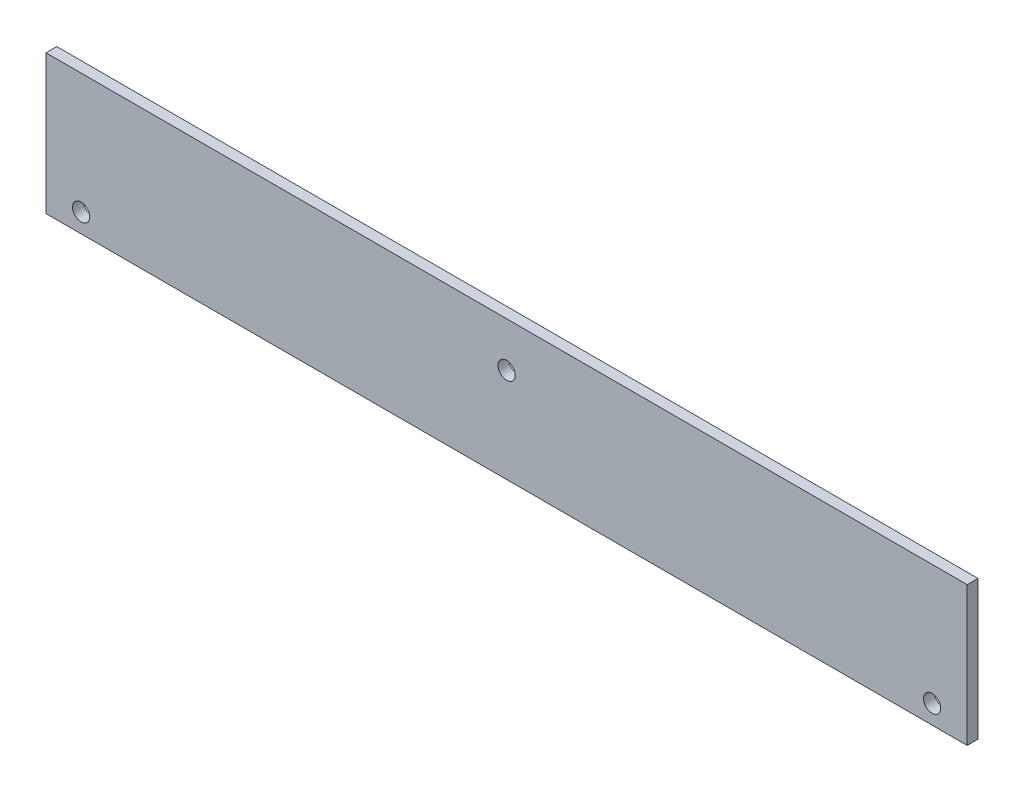
ISO-10303-21;
HEADER;
FILE_DESCRIPTION(('STEP AP214'),'2;1');
FILE_NAME('part.step','',(''),(''),'','','');
FILE_SCHEMA(('AUTOMOTIVE_DESIGN { 1 0 10303 214 1 1 1 1 }'));
ENDSEC;
DATA;
#1=APPLICATION_CONTEXT('core data for automotive mechanical design processes');
#2=APPLICATION_PROTOCOL_DEFINITION('international standard','automotive_design',2000,#1);
#3=PRODUCT_CONTEXT('',#1,'mechanical');
#4=PRODUCT('Part','Part','',(#3));
#5=PRODUCT_RELATED_PRODUCT_CATEGORY('part','',(#4));
#6=PRODUCT_DEFINITION_FORMATION('','',#4);
#7=PRODUCT_DEFINITION_CONTEXT('part definition',#1,'design');
#8=PRODUCT_DEFINITION('design','',#6,#7);
#9=PRODUCT_DEFINITION_SHAPE('','',#8);
#10=(LENGTH_UNIT() NAMED_UNIT(*) SI_UNIT(.MILLI.,.METRE.));
#11=(NAMED_UNIT(*) PLANE_ANGLE_UNIT() SI_UNIT($,.RADIAN.));
#12=(NAMED_UNIT(*) SI_UNIT($,.STERADIAN.) SOLID_ANGLE_UNIT());
#13=UNCERTAINTY_MEASURE_WITH_UNIT(LENGTH_MEASURE(1.E-05),#10,'distance_accuracy_value','');
#14=(GEOMETRIC_REPRESENTATION_CONTEXT(3) GLOBAL_UNCERTAINTY_ASSIGNED_CONTEXT((#13)) GLOBAL_UNIT_ASSIGNED_CONTEXT((#10,
#11,#12)) REPRESENTATION_CONTEXT('',''));
#15=CARTESIAN_POINT('',(0.,0.,0.));
#16=DIRECTION('',(0.,0.,1.));
#17=DIRECTION('',(1.,0.,0.));
#18=AXIS2_PLACEMENT_3D('',#15,#16,#17);
#19=CARTESIAN_POINT('',(-85.25,2.11324865405185,2.));
#20=DIRECTION('',(1.,0.,0.));
#21=DIRECTION('',(0.,0.,-1.));
#22=AXIS2_PLACEMENT_3D('',#19,#20,#21);
#23=PLANE('',#22);
#24=DIRECTION('',(0.,-1.,0.));
#25=VECTOR('',#24,1.);
#26=CARTESIAN_POINT('',(-85.25,2.11324865405185,0.));
#27=LINE('',#26,#25);
#28=CARTESIAN_POINT('',(-85.25,27.8867513459481,0.));
#29=VERTEX_POINT('',#28);
#30=CARTESIAN_POINT('',(-85.25,2.11324865405185,0.));
#31=VERTEX_POINT('',#30);
#32=EDGE_CURVE('E107',#29,#31,#27,.T.);
#33=ORIENTED_EDGE('',*,*,#32,.T.);
#34=DIRECTION('',(0.,0.,-1.));
#35=VECTOR('',#34,1.);
#36=CARTESIAN_POINT('',(-85.25,2.11324865405185,2.));
#37=LINE('',#36,#35);
#38=CARTESIAN_POINT('',(-85.25,2.11324865405185,2.));
#39=VERTEX_POINT('',#38);
#40=EDGE_CURVE('E11',#39,#31,#37,.T.);
#41=ORIENTED_EDGE('',*,*,#40,.F.);
#42=DIRECTION('',(0.,-1.,0.));
#43=VECTOR('',#42,1.);
#44=CARTESIAN_POINT('',(-85.25,2.11324865405185,2.));
#45=LINE('',#44,#43);
#46=CARTESIAN_POINT('',(-85.25,27.8867513459481,2.));
#47=VERTEX_POINT('',#46);
#48=EDGE_CURVE('E94',#47,#39,#45,.T.);
#49=ORIENTED_EDGE('',*,*,#48,.F.);
#50=DIRECTION('',(0.,0.,-1.));
#51=VECTOR('',#50,1.);
#52=CARTESIAN_POINT('',(-85.25,27.8867513459481,2.));
#53=LINE('',#52,#51);
#54=EDGE_CURVE('E103',#47,#29,#53,.T.);
#55=ORIENTED_EDGE('',*,*,#54,.T.);
#56=EDGE_LOOP('',(#33,#41,#49,#55));
#57=FACE_BOUND('',#56,.T.);
#58=ADVANCED_FACE('F41',(#57),#23,.F.);
#59=CARTESIAN_POINT('',(-85.25,2.11324865405185,2.));
#60=DIRECTION('',(0.,1.,0.));
#61=DIRECTION('',(0.,0.,1.));
#62=AXIS2_PLACEMENT_3D('',#59,#60,#61);
#63=PLANE('',#62);
#64=DIRECTION('',(1.,0.,0.));
#65=VECTOR('',#64,1.);
#66=CARTESIAN_POINT('',(-85.25,2.11324865405185,0.));
#67=LINE('',#66,#65);
#68=CARTESIAN_POINT('',(85.25,2.11324865405185,0.));
#69=VERTEX_POINT('',#68);
#70=EDGE_CURVE('E98',#31,#69,#67,.T.);
#71=ORIENTED_EDGE('',*,*,#70,.T.);
#72=DIRECTION('',(0.,0.,-1.));
#73=VECTOR('',#72,1.);
#74=CARTESIAN_POINT('',(85.25,2.11324865405185,2.));
#75=LINE('',#74,#73);
#76=CARTESIAN_POINT('',(85.25,2.11324865405185,2.));
#77=VERTEX_POINT('',#76);
#78=EDGE_CURVE('E50',#77,#69,#75,.T.);
#79=ORIENTED_EDGE('',*,*,#78,.F.);
#80=DIRECTION('',(1.,0.,0.));
#81=VECTOR('',#80,1.);
#82=CARTESIAN_POINT('',(-85.25,2.11324865405185,2.));
#83=LINE('',#82,#81);
#84=EDGE_CURVE('E89',#39,#77,#83,.T.);
#85=ORIENTED_EDGE('',*,*,#84,.F.);
#86=ORIENTED_EDGE('',*,*,#40,.T.);
#87=EDGE_LOOP('',(#71,#79,#85,#86));
#88=FACE_BOUND('',#87,.T.);
#89=ADVANCED_FACE('F97',(#88),#63,.F.);
#90=CARTESIAN_POINT('',(85.25,27.8867513459481,2.));
#91=DIRECTION('',(-1.,0.,0.));
#92=DIRECTION('',(0.,0.,1.));
#93=AXIS2_PLACEMENT_3D('',#90,#91,#92);
#94=PLANE('',#93);
#95=DIRECTION('',(0.,1.,0.));
#96=VECTOR('',#95,1.);
#97=CARTESIAN_POINT('',(85.25,27.8867513459481,0.));
#98=LINE('',#97,#96);
#99=CARTESIAN_POINT('',(85.25,27.8867513459481,0.));
#100=VERTEX_POINT('',#99);
#101=EDGE_CURVE('E76',#69,#100,#98,.T.);
#102=ORIENTED_EDGE('',*,*,#101,.T.);
#103=DIRECTION('',(0.,0.,-1.));
#104=VECTOR('',#103,1.);
#105=CARTESIAN_POINT('',(85.25,27.8867513459481,2.));
#106=LINE('',#105,#104);
#107=CARTESIAN_POINT('',(85.25,27.8867513459481,2.));
#108=VERTEX_POINT('',#107);
#109=EDGE_CURVE('E99',#108,#100,#106,.T.);
#110=ORIENTED_EDGE('',*,*,#109,.F.);
#111=DIRECTION('',(0.,1.,0.));
#112=VECTOR('',#111,1.);
#113=CARTESIAN_POINT('',(85.25,27.8867513459481,2.));
#114=LINE('',#113,#112);
#115=EDGE_CURVE('E92',#77,#108,#114,.T.);
#116=ORIENTED_EDGE('',*,*,#115,.F.);
#117=ORIENTED_EDGE('',*,*,#78,.T.);
#118=EDGE_LOOP('',(#102,#110,#116,#117));
#119=FACE_BOUND('',#118,.T.);
#120=ADVANCED_FACE('F101',(#119),#94,.F.);
#121=CARTESIAN_POINT('',(-85.25,27.8867513459481,2.));
#122=DIRECTION('',(0.,-1.,0.));
#123=DIRECTION('',(0.,0.,-1.));
#124=AXIS2_PLACEMENT_3D('',#121,#122,#123);
#125=PLANE('',#124);
#126=DIRECTION('',(-1.,0.,0.));
#127=VECTOR('',#126,1.);
#128=CARTESIAN_POINT('',(-85.25,27.8867513459481,0.));
#129=LINE('',#128,#127);
#130=EDGE_CURVE('E82',#100,#29,#129,.T.);
#131=ORIENTED_EDGE('',*,*,#130,.T.);
#132=ORIENTED_EDGE('',*,*,#54,.F.);
#133=DIRECTION('',(-1.,0.,0.));
#134=VECTOR('',#133,1.);
#135=CARTESIAN_POINT('',(-85.25,27.8867513459481,2.));
#136=LINE('',#135,#134);
#137=EDGE_CURVE('E59',#108,#47,#136,.T.);
#138=ORIENTED_EDGE('',*,*,#137,.F.);
#139=ORIENTED_EDGE('',*,*,#109,.T.);
#140=EDGE_LOOP('',(#131,#132,#138,#139));
#141=FACE_BOUND('',#140,.T.);
#142=ADVANCED_FACE('F138',(#141),#125,.F.);
#143=CARTESIAN_POINT('',(0.,0.,2.));
#144=DIRECTION('',(0.,0.,-1.));
#145=DIRECTION('',(-1.,0.,0.));
#146=AXIS2_PLACEMENT_3D('',#143,#144,#145);
#147=PLANE('',#146);
#148=CARTESIAN_POINT('',(-78.75,5.61675134594807,2.));
#149=DIRECTION('',(0.,0.,1.));
#150=DIRECTION('',(1.,0.,0.));
#151=AXIS2_PLACEMENT_3D('',#148,#149,#150);
#152=CIRCLE('',#151,1.60000000000001);
#153=CARTESIAN_POINT('',(-77.15,5.61675134594807,2.));
#154=VERTEX_POINT('',#153);
#155=EDGE_CURVE('E118',#154,#154,#152,.T.);
#156=ORIENTED_EDGE('',*,*,#155,.F.);
#157=EDGE_LOOP('',(#156));
#158=FACE_BOUND('',#157,.T.);
#159=CARTESIAN_POINT('',(78.75,5.61675134594809,2.));
#160=DIRECTION('',(0.,0.,1.));
#161=DIRECTION('',(1.,0.,0.));
#162=AXIS2_PLACEMENT_3D('',#159,#160,#161);
#163=CIRCLE('',#162,1.60000000000001);
#164=CARTESIAN_POINT('',(80.35,5.61675134594809,2.));
#165=VERTEX_POINT('',#164);
#166=EDGE_CURVE('E208',#165,#165,#163,.T.);
#167=ORIENTED_EDGE('',*,*,#166,.F.);
#168=EDGE_LOOP('',(#167));
#169=FACE_BOUND('',#168,.T.);
#170=CARTESIAN_POINT('',(0.,19.6167513459113,2.));
#171=DIRECTION('',(0.,0.,1.));
#172=DIRECTION('',(1.,0.,0.));
#173=AXIS2_PLACEMENT_3D('',#170,#171,#172);
#174=CIRCLE('',#173,1.6);
#175=CARTESIAN_POINT('',(1.6,19.6167513459113,2.));
#176=VERTEX_POINT('',#175);
#177=EDGE_CURVE('E210',#176,#176,#174,.T.);
#178=ORIENTED_EDGE('',*,*,#177,.F.);
#179=EDGE_LOOP('',(#178));
#180=FACE_BOUND('',#179,.T.);
#181=ORIENTED_EDGE('',*,*,#48,.T.);
#182=ORIENTED_EDGE('',*,*,#84,.T.);
#183=ORIENTED_EDGE('',*,*,#115,.T.);
#184=ORIENTED_EDGE('',*,*,#137,.T.);
#185=EDGE_LOOP('',(#181,#182,#183,#184));
#186=FACE_BOUND('',#185,.T.);
#187=ADVANCED_FACE('F90',(#158,#169,#180,#186),#147,.F.);
#188=CARTESIAN_POINT('',(0.,0.,0.));
#189=DIRECTION('',(0.,0.,-1.));
#190=DIRECTION('',(-1.,0.,0.));
#191=AXIS2_PLACEMENT_3D('',#188,#189,#190);
#192=PLANE('',#191);
#193=CARTESIAN_POINT('',(-78.75,5.61675134594807,0.));
#194=DIRECTION('',(0.,0.,-1.));
#195=DIRECTION('',(-1.,0.,0.));
#196=AXIS2_PLACEMENT_3D('',#193,#194,#195);
#197=CIRCLE('',#196,1.60000000000001);
#198=CARTESIAN_POINT('',(-80.35,5.61675134594807,0.));
#199=VERTEX_POINT('',#198);
#200=EDGE_CURVE('E44',#199,#199,#197,.T.);
#201=ORIENTED_EDGE('',*,*,#200,.F.);
#202=EDGE_LOOP('',(#201));
#203=FACE_BOUND('',#202,.T.);
#204=CARTESIAN_POINT('',(78.75,5.61675134594809,0.));
#205=DIRECTION('',(0.,0.,-1.));
#206=DIRECTION('',(-1.,0.,0.));
#207=AXIS2_PLACEMENT_3D('',#204,#205,#206);
#208=CIRCLE('',#207,1.60000000000001);
#209=CARTESIAN_POINT('',(77.15,5.61675134594809,0.));
#210=VERTEX_POINT('',#209);
#211=EDGE_CURVE('E117',#210,#210,#208,.T.);
#212=ORIENTED_EDGE('',*,*,#211,.F.);
#213=EDGE_LOOP('',(#212));
#214=FACE_BOUND('',#213,.T.);
#215=CARTESIAN_POINT('',(0.,19.6167513459113,0.));
#216=DIRECTION('',(0.,0.,-1.));
#217=DIRECTION('',(-1.,0.,0.));
#218=AXIS2_PLACEMENT_3D('',#215,#216,#217);
#219=CIRCLE('',#218,1.6);
#220=CARTESIAN_POINT('',(-1.6,19.6167513459113,0.));
#221=VERTEX_POINT('',#220);
#222=EDGE_CURVE('E115',#221,#221,#219,.T.);
#223=ORIENTED_EDGE('',*,*,#222,.F.);
#224=EDGE_LOOP('',(#223));
#225=FACE_BOUND('',#224,.T.);
#226=ORIENTED_EDGE('',*,*,#32,.F.);
#227=ORIENTED_EDGE('',*,*,#130,.F.);
#228=ORIENTED_EDGE('',*,*,#101,.F.);
#229=ORIENTED_EDGE('',*,*,#70,.F.);
#230=EDGE_LOOP('',(#226,#227,#228,#229));
#231=FACE_BOUND('',#230,.T.);
#232=ADVANCED_FACE('F128',(#203,#214,#225,#231),#192,.T.);
#233=CARTESIAN_POINT('',(0.,19.6167513459113,-16.));
#234=DIRECTION('',(0.,0.,1.));
#235=DIRECTION('',(1.,0.,0.));
#236=AXIS2_PLACEMENT_3D('',#233,#234,#235);
#237=CYLINDRICAL_SURFACE('',#236,1.6);
#238=ORIENTED_EDGE('',*,*,#222,.T.);
#239=EDGE_LOOP('',(#238));
#240=FACE_BOUND('',#239,.T.);
#241=ORIENTED_EDGE('',*,*,#177,.T.);
#242=EDGE_LOOP('',(#241));
#243=FACE_BOUND('',#242,.T.);
#244=ADVANCED_FACE('F131',(#240,#243),#237,.F.);
#245=CARTESIAN_POINT('',(78.75,5.61675134594809,-16.));
#246=DIRECTION('',(0.,0.,1.));
#247=DIRECTION('',(1.,0.,0.));
#248=AXIS2_PLACEMENT_3D('',#245,#246,#247);
#249=CYLINDRICAL_SURFACE('',#248,1.60000000000001);
#250=ORIENTED_EDGE('',*,*,#211,.T.);
#251=EDGE_LOOP('',(#250));
#252=FACE_BOUND('',#251,.T.);
#253=ORIENTED_EDGE('',*,*,#166,.T.);
#254=EDGE_LOOP('',(#253));
#255=FACE_BOUND('',#254,.T.);
#256=ADVANCED_FACE('F185',(#252,#255),#249,.F.);
#257=CARTESIAN_POINT('',(-78.75,5.61675134594807,-16.));
#258=DIRECTION('',(0.,0.,1.));
#259=DIRECTION('',(1.,0.,0.));
#260=AXIS2_PLACEMENT_3D('',#257,#258,#259);
#261=CYLINDRICAL_SURFACE('',#260,1.60000000000001);
#262=ORIENTED_EDGE('',*,*,#200,.T.);
#263=EDGE_LOOP('',(#262));
#264=FACE_BOUND('',#263,.T.);
#265=ORIENTED_EDGE('',*,*,#155,.T.);
#266=EDGE_LOOP('',(#265));
#267=FACE_BOUND('',#266,.T.);
#268=ADVANCED_FACE('F125',(#264,#267),#261,.F.);
#269=CLOSED_SHELL('',(#58,#89,#120,#142,#187,#232,#244,#256,#268));
#270=MANIFOLD_SOLID_BREP('B2',#269);
#271=ADVANCED_BREP_SHAPE_REPRESENTATION('',(#18,#270),#14);
#272=SHAPE_DEFINITION_REPRESENTATION(#9,#271);
ENDSEC;
END-ISO-10303-21;
